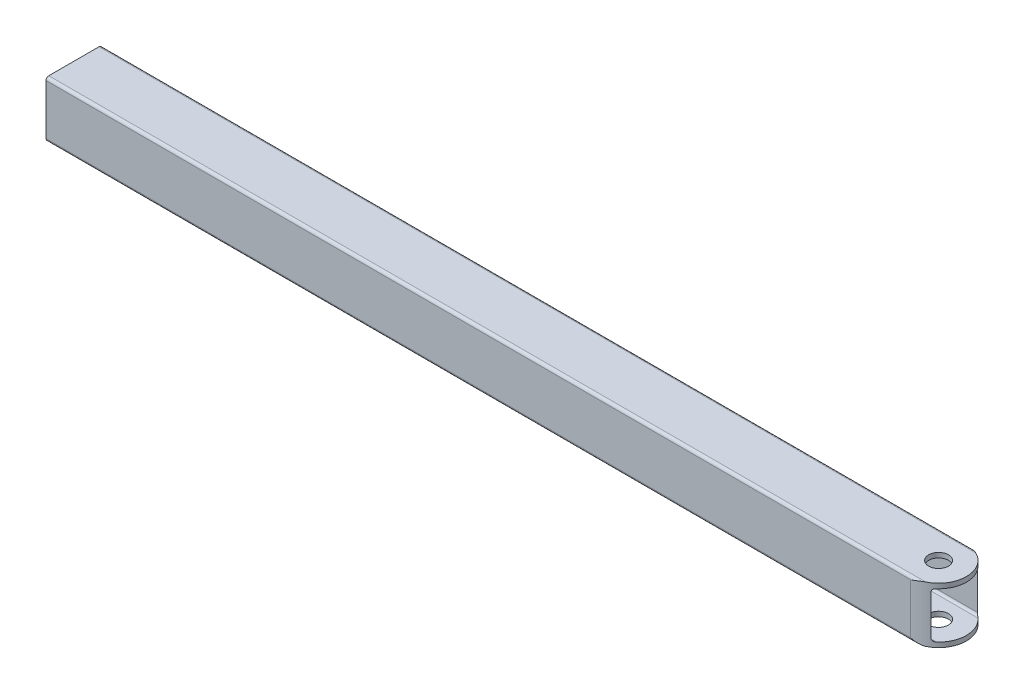
ISO-10303-21;
HEADER;
FILE_DESCRIPTION(('STEP AP214'),'2;1');
FILE_NAME('part.step','',(''),(''),'','','');
FILE_SCHEMA(('AUTOMOTIVE_DESIGN { 1 0 10303 214 1 1 1 1 }'));
ENDSEC;
DATA;
#1=APPLICATION_CONTEXT('core data for automotive mechanical design processes');
#2=APPLICATION_PROTOCOL_DEFINITION('international standard','automotive_design',2000,#1);
#3=PRODUCT_CONTEXT('',#1,'mechanical');
#4=PRODUCT('Part','Part','',(#3));
#5=PRODUCT_RELATED_PRODUCT_CATEGORY('part','',(#4));
#6=PRODUCT_DEFINITION_FORMATION('','',#4);
#7=PRODUCT_DEFINITION_CONTEXT('part definition',#1,'design');
#8=PRODUCT_DEFINITION('design','',#6,#7);
#9=PRODUCT_DEFINITION_SHAPE('','',#8);
#10=(LENGTH_UNIT() NAMED_UNIT(*) SI_UNIT(.MILLI.,.METRE.));
#11=(NAMED_UNIT(*) PLANE_ANGLE_UNIT() SI_UNIT($,.RADIAN.));
#12=(NAMED_UNIT(*) SI_UNIT($,.STERADIAN.) SOLID_ANGLE_UNIT());
#13=UNCERTAINTY_MEASURE_WITH_UNIT(LENGTH_MEASURE(1.E-05),#10,'distance_accuracy_value','');
#14=(GEOMETRIC_REPRESENTATION_CONTEXT(3) GLOBAL_UNCERTAINTY_ASSIGNED_CONTEXT((#13)) GLOBAL_UNIT_ASSIGNED_CONTEXT((#10,
#11,#12)) REPRESENTATION_CONTEXT('',''));
#15=CARTESIAN_POINT('',(0.,0.,0.));
#16=DIRECTION('',(0.,0.,1.));
#17=DIRECTION('',(1.,0.,0.));
#18=AXIS2_PLACEMENT_3D('',#15,#16,#17);
#19=CARTESIAN_POINT('',(152.4,-8.5725,-9.525));
#20=DIRECTION('',(0.,0.,1.));
#21=DIRECTION('',(1.,0.,0.));
#22=AXIS2_PLACEMENT_3D('',#19,#20,#21);
#23=PLANE('',#22);
#24=DIRECTION('',(0.,-1.,0.));
#25=VECTOR('',#24,1.);
#26=CARTESIAN_POINT('',(142.875,9.52500000000001,-9.525));
#27=LINE('',#26,#25);
#28=CARTESIAN_POINT('',(142.875,8.5725,-9.525));
#29=VERTEX_POINT('',#28);
#30=CARTESIAN_POINT('',(142.875,-8.5725,-9.525));
#31=VERTEX_POINT('',#30);
#32=EDGE_CURVE('E200',#29,#31,#27,.T.);
#33=ORIENTED_EDGE('',*,*,#32,.T.);
#34=DIRECTION('',(-1.,0.,0.));
#35=VECTOR('',#34,1.);
#36=CARTESIAN_POINT('',(152.4,-8.5725,-9.525));
#37=LINE('',#36,#35);
#38=CARTESIAN_POINT('',(-152.4,-8.5725,-9.525));
#39=VERTEX_POINT('',#38);
#40=EDGE_CURVE('E53',#31,#39,#37,.T.);
#41=ORIENTED_EDGE('',*,*,#40,.T.);
#42=DIRECTION('',(0.,1.,0.));
#43=VECTOR('',#42,1.);
#44=CARTESIAN_POINT('',(-152.4,-8.5725,-9.525));
#45=LINE('',#44,#43);
#46=CARTESIAN_POINT('',(-152.4,8.5725,-9.525));
#47=VERTEX_POINT('',#46);
#48=EDGE_CURVE('E199',#39,#47,#45,.T.);
#49=ORIENTED_EDGE('',*,*,#48,.T.);
#50=DIRECTION('',(-1.,0.,0.));
#51=VECTOR('',#50,1.);
#52=CARTESIAN_POINT('',(152.4,8.5725,-9.525));
#53=LINE('',#52,#51);
#54=EDGE_CURVE('E193',#29,#47,#53,.T.);
#55=ORIENTED_EDGE('',*,*,#54,.F.);
#56=EDGE_LOOP('',(#33,#41,#49,#55));
#57=FACE_BOUND('',#56,.T.);
#58=ADVANCED_FACE('F43',(#57),#23,.F.);
#59=CARTESIAN_POINT('',(152.4,9.525,-8.5725));
#60=DIRECTION('',(0.,-1.,0.));
#61=DIRECTION('',(0.,0.,-1.));
#62=AXIS2_PLACEMENT_3D('',#59,#60,#61);
#63=PLANE('',#62);
#64=CARTESIAN_POINT('',(142.875,9.525,0.));
#65=DIRECTION('',(0.,1.,0.));
#66=DIRECTION('',(0.,0.,1.));
#67=AXIS2_PLACEMENT_3D('',#64,#65,#66);
#68=CIRCLE('',#67,3.37819999999999);
#69=CARTESIAN_POINT('',(142.875,9.525,3.3782));
#70=VERTEX_POINT('',#69);
#71=EDGE_CURVE('E381',#70,#70,#68,.T.);
#72=ORIENTED_EDGE('',*,*,#71,.F.);
#73=EDGE_LOOP('',(#72));
#74=FACE_BOUND('',#73,.T.);
#75=DIRECTION('',(-1.,0.,0.));
#76=VECTOR('',#75,1.);
#77=CARTESIAN_POINT('',(152.4,9.525,8.5725));
#78=LINE('',#77,#76);
#79=CARTESIAN_POINT('',(147.026851243722,9.525,8.5725));
#80=VERTEX_POINT('',#79);
#81=CARTESIAN_POINT('',(-152.4,9.525,8.5725));
#82=VERTEX_POINT('',#81);
#83=EDGE_CURVE('E189',#80,#82,#78,.T.);
#84=ORIENTED_EDGE('',*,*,#83,.F.);
#85=CARTESIAN_POINT('',(142.875,9.52500000000001,0.));
#86=DIRECTION('',(0.,1.,0.));
#87=DIRECTION('',(0.,0.,1.));
#88=AXIS2_PLACEMENT_3D('',#85,#86,#87);
#89=CIRCLE('',#88,9.525);
#90=CARTESIAN_POINT('',(147.026851243722,9.52500000000001,-8.57249999999999));
#91=VERTEX_POINT('',#90);
#92=EDGE_CURVE('E162',#80,#91,#89,.T.);
#93=ORIENTED_EDGE('',*,*,#92,.T.);
#94=DIRECTION('',(-1.,0.,0.));
#95=VECTOR('',#94,1.);
#96=CARTESIAN_POINT('',(152.4,9.525,-8.5725));
#97=LINE('',#96,#95);
#98=CARTESIAN_POINT('',(-152.4,9.525,-8.5725));
#99=VERTEX_POINT('',#98);
#100=EDGE_CURVE('E191',#91,#99,#97,.T.);
#101=ORIENTED_EDGE('',*,*,#100,.T.);
#102=DIRECTION('',(0.,0.,1.));
#103=VECTOR('',#102,1.);
#104=CARTESIAN_POINT('',(-152.4,9.525,-8.5725));
#105=LINE('',#104,#103);
#106=EDGE_CURVE('E217',#99,#82,#105,.T.);
#107=ORIENTED_EDGE('',*,*,#106,.T.);
#108=EDGE_LOOP('',(#84,#93,#101,#107));
#109=FACE_BOUND('',#108,.T.);
#110=ADVANCED_FACE('F366',(#74,#109),#63,.F.);
#111=CARTESIAN_POINT('',(152.4,-9.525,-8.5725));
#112=DIRECTION('',(0.,1.,0.));
#113=DIRECTION('',(0.,0.,1.));
#114=AXIS2_PLACEMENT_3D('',#111,#112,#113);
#115=PLANE('',#114);
#116=CARTESIAN_POINT('',(142.875,-9.52500000000001,0.));
#117=DIRECTION('',(0.,1.,0.));
#118=DIRECTION('',(0.,0.,1.));
#119=AXIS2_PLACEMENT_3D('',#116,#117,#118);
#120=CIRCLE('',#119,3.37819999999999);
#121=CARTESIAN_POINT('',(142.875,-9.52500000000001,3.3782));
#122=VERTEX_POINT('',#121);
#123=EDGE_CURVE('E402',#122,#122,#120,.T.);
#124=ORIENTED_EDGE('',*,*,#123,.T.);
#125=EDGE_LOOP('',(#124));
#126=FACE_BOUND('',#125,.T.);
#127=DIRECTION('',(-1.,0.,0.));
#128=VECTOR('',#127,1.);
#129=CARTESIAN_POINT('',(152.4,-9.525,-8.5725));
#130=LINE('',#129,#128);
#131=CARTESIAN_POINT('',(147.026851243722,-9.525,-8.5725));
#132=VERTEX_POINT('',#131);
#133=CARTESIAN_POINT('',(-152.4,-9.525,-8.5725));
#134=VERTEX_POINT('',#133);
#135=EDGE_CURVE('E168',#132,#134,#130,.T.);
#136=ORIENTED_EDGE('',*,*,#135,.F.);
#137=CARTESIAN_POINT('',(142.875,-9.525,0.));
#138=DIRECTION('',(0.,1.,0.));
#139=DIRECTION('',(0.,0.,1.));
#140=AXIS2_PLACEMENT_3D('',#137,#138,#139);
#141=CIRCLE('',#140,9.525);
#142=CARTESIAN_POINT('',(147.026851243722,-9.52500000000001,8.5725));
#143=VERTEX_POINT('',#142);
#144=EDGE_CURVE('E60',#143,#132,#141,.T.);
#145=ORIENTED_EDGE('',*,*,#144,.F.);
#146=DIRECTION('',(-1.,0.,0.));
#147=VECTOR('',#146,1.);
#148=CARTESIAN_POINT('',(152.4,-9.525,8.5725));
#149=LINE('',#148,#147);
#150=CARTESIAN_POINT('',(-152.4,-9.525,8.5725));
#151=VERTEX_POINT('',#150);
#152=EDGE_CURVE('E177',#143,#151,#149,.T.);
#153=ORIENTED_EDGE('',*,*,#152,.T.);
#154=DIRECTION('',(0.,0.,-1.));
#155=VECTOR('',#154,1.);
#156=CARTESIAN_POINT('',(-152.4,-9.525,-8.5725));
#157=LINE('',#156,#155);
#158=EDGE_CURVE('E176',#151,#134,#157,.T.);
#159=ORIENTED_EDGE('',*,*,#158,.T.);
#160=EDGE_LOOP('',(#136,#145,#153,#159));
#161=FACE_BOUND('',#160,.T.);
#162=ADVANCED_FACE('F174',(#126,#161),#115,.F.);
#163=CARTESIAN_POINT('',(152.4,7.874,-7.0866));
#164=DIRECTION('',(0.,-1.,0.));
#165=DIRECTION('',(0.,0.,-1.));
#166=AXIS2_PLACEMENT_3D('',#163,#164,#165);
#167=PLANE('',#166);
#168=CARTESIAN_POINT('',(142.875,7.874,0.));
#169=DIRECTION('',(0.,-1.,0.));
#170=DIRECTION('',(0.,0.,-1.));
#171=AXIS2_PLACEMENT_3D('',#168,#169,#170);
#172=CIRCLE('',#171,3.37819999999999);
#173=CARTESIAN_POINT('',(142.875,7.874,-3.37819999999999));
#174=VERTEX_POINT('',#173);
#175=EDGE_CURVE('E163',#174,#174,#172,.T.);
#176=ORIENTED_EDGE('',*,*,#175,.F.);
#177=EDGE_LOOP('',(#176));
#178=FACE_BOUND('',#177,.T.);
#179=CARTESIAN_POINT('',(142.875,7.874,0.));
#180=DIRECTION('',(0.,-1.,0.));
#181=DIRECTION('',(0.,0.,-1.));
#182=AXIS2_PLACEMENT_3D('',#179,#180,#181);
#183=CIRCLE('',#182,9.525);
#184=CARTESIAN_POINT('',(149.239410847832,7.874,7.0866));
#185=VERTEX_POINT('',#184);
#186=CARTESIAN_POINT('',(149.239410847832,7.874,-7.0866));
#187=VERTEX_POINT('',#186);
#188=EDGE_CURVE('E251',#185,#187,#183,.F.);
#189=ORIENTED_EDGE('',*,*,#188,.F.);
#190=DIRECTION('',(-1.,0.,0.));
#191=VECTOR('',#190,1.);
#192=CARTESIAN_POINT('',(152.4,7.874,7.0866));
#193=LINE('',#192,#191);
#194=CARTESIAN_POINT('',(-152.4,7.874,7.0866));
#195=VERTEX_POINT('',#194);
#196=EDGE_CURVE('E182',#185,#195,#193,.T.);
#197=ORIENTED_EDGE('',*,*,#196,.T.);
#198=DIRECTION('',(0.,0.,1.));
#199=VECTOR('',#198,1.);
#200=CARTESIAN_POINT('',(-152.4,7.874,-7.0866));
#201=LINE('',#200,#199);
#202=CARTESIAN_POINT('',(-152.4,7.874,-7.0866));
#203=VERTEX_POINT('',#202);
#204=EDGE_CURVE('E249',#203,#195,#201,.T.);
#205=ORIENTED_EDGE('',*,*,#204,.F.);
#206=DIRECTION('',(-1.,0.,0.));
#207=VECTOR('',#206,1.);
#208=CARTESIAN_POINT('',(152.4,7.874,-7.0866));
#209=LINE('',#208,#207);
#210=EDGE_CURVE('E178',#187,#203,#209,.T.);
#211=ORIENTED_EDGE('',*,*,#210,.F.);
#212=EDGE_LOOP('',(#189,#197,#205,#211));
#213=FACE_BOUND('',#212,.T.);
#214=ADVANCED_FACE('F246',(#178,#213),#167,.T.);
#215=CARTESIAN_POINT('',(152.4,-7.874,-7.0866));
#216=DIRECTION('',(0.,1.,0.));
#217=DIRECTION('',(0.,0.,1.));
#218=AXIS2_PLACEMENT_3D('',#215,#216,#217);
#219=PLANE('',#218);
#220=CARTESIAN_POINT('',(142.875,-7.874,0.));
#221=DIRECTION('',(0.,1.,0.));
#222=DIRECTION('',(0.,0.,1.));
#223=AXIS2_PLACEMENT_3D('',#220,#221,#222);
#224=CIRCLE('',#223,3.37819999999999);
#225=CARTESIAN_POINT('',(142.875,-7.874,3.3782));
#226=VERTEX_POINT('',#225);
#227=EDGE_CURVE('E48',#226,#226,#224,.T.);
#228=ORIENTED_EDGE('',*,*,#227,.F.);
#229=EDGE_LOOP('',(#228));
#230=FACE_BOUND('',#229,.T.);
#231=CARTESIAN_POINT('',(142.875,-7.874,0.));
#232=DIRECTION('',(0.,1.,0.));
#233=DIRECTION('',(0.,0.,1.));
#234=AXIS2_PLACEMENT_3D('',#231,#232,#233);
#235=CIRCLE('',#234,9.525);
#236=CARTESIAN_POINT('',(149.239410847832,-7.874,-7.0866));
#237=VERTEX_POINT('',#236);
#238=CARTESIAN_POINT('',(149.239410847832,-7.874,7.0866));
#239=VERTEX_POINT('',#238);
#240=EDGE_CURVE('E288',#237,#239,#235,.F.);
#241=ORIENTED_EDGE('',*,*,#240,.F.);
#242=DIRECTION('',(-1.,0.,0.));
#243=VECTOR('',#242,1.);
#244=CARTESIAN_POINT('',(152.4,-7.874,-7.0866));
#245=LINE('',#244,#243);
#246=CARTESIAN_POINT('',(-152.4,-7.874,-7.0866));
#247=VERTEX_POINT('',#246);
#248=EDGE_CURVE('E234',#237,#247,#245,.T.);
#249=ORIENTED_EDGE('',*,*,#248,.T.);
#250=DIRECTION('',(0.,0.,-1.));
#251=VECTOR('',#250,1.);
#252=CARTESIAN_POINT('',(-152.4,-7.874,-7.0866));
#253=LINE('',#252,#251);
#254=CARTESIAN_POINT('',(-152.4,-7.874,7.0866));
#255=VERTEX_POINT('',#254);
#256=EDGE_CURVE('E271',#255,#247,#253,.T.);
#257=ORIENTED_EDGE('',*,*,#256,.F.);
#258=DIRECTION('',(-1.,0.,0.));
#259=VECTOR('',#258,1.);
#260=CARTESIAN_POINT('',(152.4,-7.874,7.0866));
#261=LINE('',#260,#259);
#262=EDGE_CURVE('E236',#239,#255,#261,.T.);
#263=ORIENTED_EDGE('',*,*,#262,.F.);
#264=EDGE_LOOP('',(#241,#249,#257,#263));
#265=FACE_BOUND('',#264,.T.);
#266=ADVANCED_FACE('F410',(#230,#265),#219,.T.);
#267=CARTESIAN_POINT('',(152.4,-8.5725,-8.57250000000001));
#268=DIRECTION('',(-1.,0.,0.));
#269=DIRECTION('',(0.,0.,1.));
#270=AXIS2_PLACEMENT_3D('',#267,#268,#269);
#271=CYLINDRICAL_SURFACE('',#270,0.952499999999997);
#272=ORIENTED_EDGE('',*,*,#40,.F.);
#273=CARTESIAN_POINT('',(147.026851243722,-9.525,-8.5725));
#274=CARTESIAN_POINT('',(146.957964048173,-9.52498554189875,-8.60586552795667));
#275=CARTESIAN_POINT('',(146.888690489495,-9.52324763645544,-8.63838924502475));
#276=CARTESIAN_POINT('',(146.749526256003,-9.51673705058331,-8.70169543137904));
#277=CARTESIAN_POINT('',(146.679635857857,-9.51196566869114,-8.73247863958599));
#278=CARTESIAN_POINT('',(146.539471236643,-9.49981139954743,-8.79221648535186));
#279=CARTESIAN_POINT('',(146.469198028165,-9.49243362436644,-8.82117457253954));
#280=CARTESIAN_POINT('',(146.328216150287,-9.47538748245734,-8.87731274693715));
#281=CARTESIAN_POINT('',(146.257507428818,-9.46571883644631,-8.90449261684644));
#282=CARTESIAN_POINT('',(146.045436409541,-9.43379882390901,-8.98312990539054));
#283=CARTESIAN_POINT('',(145.903527469787,-9.40857615573225,-9.03194103835549));
#284=CARTESIAN_POINT('',(145.618641226107,-9.35197549229294,-9.12252311165041));
#285=CARTESIAN_POINT('',(145.475663295356,-9.32059355966789,-9.16428951665411));
#286=CARTESIAN_POINT('',(145.130800697768,-9.2393751543217,-9.25637473285302));
#287=CARTESIAN_POINT('',(144.928544961312,-9.18721620562017,-9.3032913480507));
#288=CARTESIAN_POINT('',(144.523170870755,-9.07653533517809,-9.38359710108552));
#289=CARTESIAN_POINT('',(144.320052392097,-9.01801246240408,-9.41698421352199));
#290=CARTESIAN_POINT('',(143.709706879091,-8.83643126141263,-9.49722291968856));
#291=CARTESIAN_POINT('',(143.301362722,-8.70732734800355,-9.52418539754674));
#292=CARTESIAN_POINT('',(142.887407096813,-8.57642344867504,-9.52499393532463));
#293=CARTESIAN_POINT('',(142.881203476188,-8.57446169112702,-9.52499999552055));
#294=CARTESIAN_POINT('',(142.875,-8.5725,-9.525));
#295=B_SPLINE_CURVE_WITH_KNOTS('',3,(#273,#274,#275,#276,#277,#278,#279,#280,#281,#282,#283,
#284,#285,#286,#287,#288,#289,#290,#291,#292,#293,#294),.UNSPECIFIED.,.F.,.F.,(4,2,2,2,2,2,2,2,
2,2,4),(0.,0.229573949060686,0.45904969078246,0.688077824637956,0.917133893976532,
1.37328126370581,1.82972118491536,2.47129320771587,3.11296124001593,4.39589373575992,
4.4154129655239),.UNSPECIFIED.);
#296=EDGE_CURVE('E157',#31,#132,#295,.F.);
#297=ORIENTED_EDGE('',*,*,#296,.T.);
#298=ORIENTED_EDGE('',*,*,#135,.T.);
#299=CARTESIAN_POINT('',(-152.4,-8.5725,-8.57250000000001));
#300=DIRECTION('',(1.,0.,0.));
#301=DIRECTION('',(0.,0.,-1.));
#302=AXIS2_PLACEMENT_3D('',#299,#300,#301);
#303=CIRCLE('',#302,0.952499999999997);
#304=EDGE_CURVE('E204',#134,#39,#303,.T.);
#305=ORIENTED_EDGE('',*,*,#304,.T.);
#306=EDGE_LOOP('',(#272,#297,#298,#305));
#307=FACE_BOUND('',#306,.T.);
#308=ADVANCED_FACE('F45',(#307),#271,.T.);
#309=CARTESIAN_POINT('',(152.4,8.5725,-8.5725));
#310=DIRECTION('',(-1.,0.,0.));
#311=DIRECTION('',(0.,0.,1.));
#312=AXIS2_PLACEMENT_3D('',#309,#310,#311);
#313=CYLINDRICAL_SURFACE('',#312,0.9525);
#314=ORIENTED_EDGE('',*,*,#100,.F.);
#315=CARTESIAN_POINT('',(147.026851243722,9.525,-8.5725));
#316=CARTESIAN_POINT('',(146.957964048173,9.52498554189875,-8.6058655279566));
#317=CARTESIAN_POINT('',(146.888690489495,9.52324763645545,-8.63838924502461));
#318=CARTESIAN_POINT('',(146.749526256004,9.51673705058334,-8.70169543137878));
#319=CARTESIAN_POINT('',(146.679635857858,9.51196566869119,-8.73247863958567));
#320=CARTESIAN_POINT('',(146.539471236644,9.49981139954752,-8.79221648535145));
#321=CARTESIAN_POINT('',(146.469198028166,9.49243362436656,-8.8211745725391));
#322=CARTESIAN_POINT('',(146.328216150288,9.47538748245751,-8.87731274693665));
#323=CARTESIAN_POINT('',(146.257507428819,9.46571883644651,-8.90449261684591));
#324=CARTESIAN_POINT('',(146.045436409543,9.43379882390923,-8.98312990539009));
#325=CARTESIAN_POINT('',(145.903527469788,9.40857615573246,-9.03194103835515));
#326=CARTESIAN_POINT('',(145.618641226108,9.35197549229303,-9.12252311165026));
#327=CARTESIAN_POINT('',(145.475663295356,9.32059355966787,-9.16428951665404));
#328=CARTESIAN_POINT('',(145.130800697768,9.23937515432179,-9.25637473285303));
#329=CARTESIAN_POINT('',(144.928544961311,9.18721620562059,-9.30329134805072));
#330=CARTESIAN_POINT('',(144.523170870755,9.07653533517759,-9.38359710108556));
#331=CARTESIAN_POINT('',(144.320052392097,9.01801246240232,-9.41698421352203));
#332=CARTESIAN_POINT('',(143.709706879089,8.83643126141593,-9.49722291968856));
#333=CARTESIAN_POINT('',(143.301362721994,8.70732734802196,-9.5241853975467));
#334=CARTESIAN_POINT('',(142.887407096813,8.57642344867561,-9.52499393532463));
#335=CARTESIAN_POINT('',(142.881203476188,8.57446169112731,-9.52499999552054));
#336=CARTESIAN_POINT('',(142.875,8.5725,-9.525));
#337=B_SPLINE_CURVE_WITH_KNOTS('',3,(#315,#316,#317,#318,#319,#320,#321,#322,#323,#324,#325,
#326,#327,#328,#329,#330,#331,#332,#333,#334,#335,#336),.UNSPECIFIED.,.F.,.F.,(4,2,2,2,2,2,2,2,
2,2,4),(0.,0.229573949060225,0.459049690781491,0.68807782463672,0.917133893974885,
1.37328126370503,1.82972118491539,2.47129320771601,3.11296124001633,4.39589373575986,
4.4154129655239),.UNSPECIFIED.);
#338=EDGE_CURVE('E171',#91,#29,#337,.T.);
#339=ORIENTED_EDGE('',*,*,#338,.T.);
#340=ORIENTED_EDGE('',*,*,#54,.T.);
#341=CARTESIAN_POINT('',(-152.4,8.5725,-8.5725));
#342=DIRECTION('',(1.,0.,0.));
#343=DIRECTION('',(0.,0.,-1.));
#344=AXIS2_PLACEMENT_3D('',#341,#342,#343);
#345=CIRCLE('',#344,0.9525);
#346=EDGE_CURVE('E207',#47,#99,#345,.T.);
#347=ORIENTED_EDGE('',*,*,#346,.T.);
#348=EDGE_LOOP('',(#314,#339,#340,#347));
#349=FACE_BOUND('',#348,.T.);
#350=ADVANCED_FACE('F360',(#349),#313,.T.);
#351=CARTESIAN_POINT('',(152.4,8.5725,8.5725));
#352=DIRECTION('',(-1.,0.,0.));
#353=DIRECTION('',(0.,0.,1.));
#354=AXIS2_PLACEMENT_3D('',#351,#352,#353);
#355=CYLINDRICAL_SURFACE('',#354,0.952500000000002);
#356=DIRECTION('',(-1.,0.,0.));
#357=VECTOR('',#356,1.);
#358=CARTESIAN_POINT('',(152.4,8.5725,9.525));
#359=LINE('',#358,#357);
#360=CARTESIAN_POINT('',(142.875,8.5725,9.52500000000001));
#361=VERTEX_POINT('',#360);
#362=CARTESIAN_POINT('',(-152.4,8.5725,9.525));
#363=VERTEX_POINT('',#362);
#364=EDGE_CURVE('E187',#361,#363,#359,.T.);
#365=ORIENTED_EDGE('',*,*,#364,.F.);
#366=CARTESIAN_POINT('',(147.026851243722,9.525,8.5725));
#367=CARTESIAN_POINT('',(146.957964048173,9.52498554189875,8.60586552795672));
#368=CARTESIAN_POINT('',(146.888690489495,9.52324763645544,8.63838924502484));
#369=CARTESIAN_POINT('',(146.749526256003,9.51673705058329,8.70169543137922));
#370=CARTESIAN_POINT('',(146.679635857856,9.51196566869111,8.73247863958621));
#371=CARTESIAN_POINT('',(146.539471236642,9.49981139954736,8.79221648535215));
#372=CARTESIAN_POINT('',(146.469198028164,9.49243362436636,8.82117457253986));
#373=CARTESIAN_POINT('',(146.328216150286,9.47538748245722,8.87731274693752));
#374=CARTESIAN_POINT('',(146.257507428817,9.46571883644618,8.90449261684683));
#375=CARTESIAN_POINT('',(146.04543640954,9.43379882390886,8.98312990539084));
#376=CARTESIAN_POINT('',(145.903527469786,9.40857615573212,9.03194103835571));
#377=CARTESIAN_POINT('',(145.618641226107,9.35197549229289,9.1225231116505));
#378=CARTESIAN_POINT('',(145.475663295356,9.3205935596679,9.16428951665415));
#379=CARTESIAN_POINT('',(145.130800697769,9.23937515432164,9.25637473285301));
#380=CARTESIAN_POINT('',(144.928544961312,9.18721620561988,9.30329134805069));
#381=CARTESIAN_POINT('',(144.523170870756,9.07653533517844,9.3835971010855));
#382=CARTESIAN_POINT('',(144.320052392097,9.01801246240531,9.41698421352196));
#383=CARTESIAN_POINT('',(143.709706879092,8.83643126141035,9.49722291968854));
#384=CARTESIAN_POINT('',(143.301362722004,8.7073273479908,9.52418539754675));
#385=CARTESIAN_POINT('',(142.887407096814,8.57642344867466,9.52499393532464));
#386=CARTESIAN_POINT('',(142.881203476188,8.57446169112683,9.52499999552055));
#387=CARTESIAN_POINT('',(142.875,8.5725,9.52500000000001));
#388=B_SPLINE_CURVE_WITH_KNOTS('',3,(#366,#367,#368,#369,#370,#371,#372,#373,#374,#375,#376,
#377,#378,#379,#380,#381,#382,#383,#384,#385,#386,#387),.UNSPECIFIED.,.F.,.F.,(4,2,2,2,2,2,2,2,
2,2,4),(0.,0.229573949061022,0.459049690783098,0.68807782463889,0.91713389397767,
1.37328126370631,1.82972118491533,2.47129320771576,3.11296124001564,4.39589373575988,
4.4154129655239),.UNSPECIFIED.);
#389=EDGE_CURVE('E343',#361,#80,#388,.F.);
#390=ORIENTED_EDGE('',*,*,#389,.T.);
#391=ORIENTED_EDGE('',*,*,#83,.T.);
#392=CARTESIAN_POINT('',(-152.4,8.5725,8.5725));
#393=DIRECTION('',(1.,0.,0.));
#394=DIRECTION('',(0.,0.,-1.));
#395=AXIS2_PLACEMENT_3D('',#392,#393,#394);
#396=CIRCLE('',#395,0.952500000000002);
#397=EDGE_CURVE('E220',#82,#363,#396,.T.);
#398=ORIENTED_EDGE('',*,*,#397,.T.);
#399=EDGE_LOOP('',(#365,#390,#391,#398));
#400=FACE_BOUND('',#399,.T.);
#401=ADVANCED_FACE('F364',(#400),#355,.T.);
#402=CARTESIAN_POINT('',(152.4,-8.5725,9.525));
#403=DIRECTION('',(0.,0.,-1.));
#404=DIRECTION('',(-1.,0.,0.));
#405=AXIS2_PLACEMENT_3D('',#402,#403,#404);
#406=PLANE('',#405);
#407=DIRECTION('',(-1.,0.,0.));
#408=VECTOR('',#407,1.);
#409=CARTESIAN_POINT('',(152.4,-8.5725,9.525));
#410=LINE('',#409,#408);
#411=CARTESIAN_POINT('',(142.875,-8.5725,9.525));
#412=VERTEX_POINT('',#411);
#413=CARTESIAN_POINT('',(-152.4,-8.5725,9.525));
#414=VERTEX_POINT('',#413);
#415=EDGE_CURVE('E180',#412,#414,#410,.T.);
#416=ORIENTED_EDGE('',*,*,#415,.F.);
#417=DIRECTION('',(0.,-1.,0.));
#418=VECTOR('',#417,1.);
#419=CARTESIAN_POINT('',(142.875,9.525,9.52500000000001));
#420=LINE('',#419,#418);
#421=EDGE_CURVE('E395',#361,#412,#420,.T.);
#422=ORIENTED_EDGE('',*,*,#421,.F.);
#423=ORIENTED_EDGE('',*,*,#364,.T.);
#424=DIRECTION('',(0.,-1.,0.));
#425=VECTOR('',#424,1.);
#426=CARTESIAN_POINT('',(-152.4,-8.5725,9.525));
#427=LINE('',#426,#425);
#428=EDGE_CURVE('E223',#363,#414,#427,.T.);
#429=ORIENTED_EDGE('',*,*,#428,.T.);
#430=EDGE_LOOP('',(#416,#422,#423,#429));
#431=FACE_BOUND('',#430,.T.);
#432=ADVANCED_FACE('F393',(#431),#406,.F.);
#433=CARTESIAN_POINT('',(152.4,-8.5725,8.5725));
#434=DIRECTION('',(-1.,0.,0.));
#435=DIRECTION('',(0.,0.,1.));
#436=AXIS2_PLACEMENT_3D('',#433,#434,#435);
#437=CYLINDRICAL_SURFACE('',#436,0.952499999999998);
#438=ORIENTED_EDGE('',*,*,#152,.F.);
#439=CARTESIAN_POINT('',(147.026851243722,-9.525,8.5725));
#440=CARTESIAN_POINT('',(146.957964048173,-9.52498554189875,8.60586552795667));
#441=CARTESIAN_POINT('',(146.888690489495,-9.52324763645545,8.63838924502475));
#442=CARTESIAN_POINT('',(146.749526256003,-9.51673705058332,8.70169543137904));
#443=CARTESIAN_POINT('',(146.679635857857,-9.51196566869114,8.73247863958599));
#444=CARTESIAN_POINT('',(146.539471236643,-9.49981139954743,8.79221648535186));
#445=CARTESIAN_POINT('',(146.469198028165,-9.49243362436645,8.82117457253954));
#446=CARTESIAN_POINT('',(146.328216150287,-9.47538748245735,8.87731274693715));
#447=CARTESIAN_POINT('',(146.257507428818,-9.46571883644632,8.90449261684644));
#448=CARTESIAN_POINT('',(146.045436409541,-9.43379882390902,8.98312990539054));
#449=CARTESIAN_POINT('',(145.903527469787,-9.40857615573226,9.03194103835549));
#450=CARTESIAN_POINT('',(145.618641226107,-9.35197549229295,9.12252311165041));
#451=CARTESIAN_POINT('',(145.475663295356,-9.32059355966789,9.16428951665411));
#452=CARTESIAN_POINT('',(145.130800697768,-9.23937515432171,9.25637473285302));
#453=CARTESIAN_POINT('',(144.928544961312,-9.18721620562017,9.3032913480507));
#454=CARTESIAN_POINT('',(144.523170870755,-9.07653533517809,9.38359710108552));
#455=CARTESIAN_POINT('',(144.320052392097,-9.01801246240409,9.41698421352199));
#456=CARTESIAN_POINT('',(143.709706879091,-8.83643126141263,9.49722291968856));
#457=CARTESIAN_POINT('',(143.301362722,-8.70732734800355,9.52418539754674));
#458=CARTESIAN_POINT('',(142.887407096813,-8.57642344867504,9.52499393532463));
#459=CARTESIAN_POINT('',(142.881203476188,-8.57446169112702,9.52499999552055));
#460=CARTESIAN_POINT('',(142.875,-8.5725,9.525));
#461=B_SPLINE_CURVE_WITH_KNOTS('',3,(#439,#440,#441,#442,#443,#444,#445,#446,#447,#448,#449,
#450,#451,#452,#453,#454,#455,#456,#457,#458,#459,#460),.UNSPECIFIED.,.F.,.F.,(4,2,2,2,2,2,2,2,
2,2,4),(0.,0.229573949060686,0.45904969078246,0.688077824637956,0.917133893976532,
1.37328126370581,1.82972118491536,2.47129320771587,3.11296124001593,4.39589373575992,
4.4154129655239),.UNSPECIFIED.);
#462=EDGE_CURVE('E160',#143,#412,#461,.T.);
#463=ORIENTED_EDGE('',*,*,#462,.T.);
#464=ORIENTED_EDGE('',*,*,#415,.T.);
#465=CARTESIAN_POINT('',(-152.4,-8.5725,8.5725));
#466=DIRECTION('',(1.,0.,0.));
#467=DIRECTION('',(0.,0.,-1.));
#468=AXIS2_PLACEMENT_3D('',#465,#466,#467);
#469=CIRCLE('',#468,0.952499999999998);
#470=EDGE_CURVE('E226',#414,#151,#469,.T.);
#471=ORIENTED_EDGE('',*,*,#470,.T.);
#472=EDGE_LOOP('',(#438,#463,#464,#471));
#473=FACE_BOUND('',#472,.T.);
#474=ADVANCED_FACE('F514',(#473),#437,.T.);
#475=CARTESIAN_POINT('',(152.4,7.0866,-7.0866));
#476=DIRECTION('',(-1.,0.,0.));
#477=DIRECTION('',(0.,0.,1.));
#478=AXIS2_PLACEMENT_3D('',#475,#476,#477);
#479=CYLINDRICAL_SURFACE('',#478,0.787399999999998);
#480=CARTESIAN_POINT('',(149.239410847832,7.874,-7.0866));
#481=CARTESIAN_POINT('',(149.201934460014,7.87398357066911,-7.12026213212581));
#482=CARTESIAN_POINT('',(149.164194173684,7.87184134289685,-7.15361442386383));
#483=CARTESIAN_POINT('',(149.088428619272,7.86341571502308,-7.21951756860481));
#484=CARTESIAN_POINT('',(149.050403170733,7.85712942672233,-7.25206784621961));
#485=CARTESIAN_POINT('',(148.973966838353,7.84043990644751,-7.3164715877842));
#486=CARTESIAN_POINT('',(148.9355560685,7.82999444320449,-7.34831425147891));
#487=CARTESIAN_POINT('',(148.859076303683,7.80497974791537,-7.4107280961885));
#488=CARTESIAN_POINT('',(148.821007166958,7.79041231645278,-7.44129982570764));
#489=CARTESIAN_POINT('',(148.73121936188,7.75068239288444,-7.51230436965415));
#490=CARTESIAN_POINT('',(148.679808023038,7.72359722089956,-7.55207249170567));
#491=CARTESIAN_POINT('',(148.579862162306,7.6605976045481,-7.62784820782067));
#492=CARTESIAN_POINT('',(148.531317860384,7.62471562008913,-7.66386894886882));
#493=CARTESIAN_POINT('',(148.457619060937,7.55870332653478,-7.71758980327453));
#494=CARTESIAN_POINT('',(148.430754534933,7.53183100580679,-7.73693700975238));
#495=CARTESIAN_POINT('',(148.380060538691,7.47377180767744,-7.77308781067051));
#496=CARTESIAN_POINT('',(148.356228755105,7.4425882571893,-7.78989334574116));
#497=CARTESIAN_POINT('',(148.318715345237,7.3841291982214,-7.81613555176024));
#498=CARTESIAN_POINT('',(148.303994720153,7.35788262838994,-7.82635872521813));
#499=CARTESIAN_POINT('',(148.278121761627,7.30294806719061,-7.84424281202358));
#500=CARTESIAN_POINT('',(148.266955691379,7.27427003057895,-7.85191359458473));
#501=CARTESIAN_POINT('',(148.250571480536,7.21941585767978,-7.86313839559197));
#502=CARTESIAN_POINT('',(148.244703659934,7.19353082537206,-7.86714343600911));
#503=CARTESIAN_POINT('',(148.236689574656,7.14066491553116,-7.87260557526378));
#504=CARTESIAN_POINT('',(148.234582387169,7.11367547900438,-7.87403592144693));
#505=CARTESIAN_POINT('',(148.234640752886,7.0866,-7.874));
#506=B_SPLINE_CURVE_WITH_KNOTS('',3,(#480,#481,#482,#483,#484,#485,#486,#487,#488,#489,#490,
#491,#492,#493,#494,#495,#496,#497,#498,#499,#500,#501,#502,#503,#504,#505),.UNSPECIFIED.,.F.,
.F.,(4,2,2,2,2,2,2,2,2,2,2,2,4),(0.,0.151062827702844,0.302231049973471,0.454975023805234,
0.607652377807957,0.818316823528686,1.02821532614404,1.15584415990343,1.28337504844651,
1.37840918445569,1.47307146633958,1.55321170403661,1.63417994405896),.UNSPECIFIED.);
#507=CARTESIAN_POINT('',(148.234640752886,7.0866,-7.874));
#508=VERTEX_POINT('',#507);
#509=EDGE_CURVE('E67',#187,#508,#506,.T.);
#510=ORIENTED_EDGE('',*,*,#509,.F.);
#511=ORIENTED_EDGE('',*,*,#210,.T.);
#512=CARTESIAN_POINT('',(-152.4,7.0866,-7.0866));
#513=DIRECTION('',(1.,0.,0.));
#514=DIRECTION('',(0.,0.,-1.));
#515=AXIS2_PLACEMENT_3D('',#512,#513,#514);
#516=CIRCLE('',#515,0.787399999999998);
#517=CARTESIAN_POINT('',(-152.4,7.0866,-7.874));
#518=VERTEX_POINT('',#517);
#519=EDGE_CURVE('E170',#518,#203,#516,.T.);
#520=ORIENTED_EDGE('',*,*,#519,.F.);
#521=DIRECTION('',(-1.,0.,0.));
#522=VECTOR('',#521,1.);
#523=CARTESIAN_POINT('',(152.4,7.0866,-7.874));
#524=LINE('',#523,#522);
#525=EDGE_CURVE('E230',#508,#518,#524,.T.);
#526=ORIENTED_EDGE('',*,*,#525,.F.);
#527=EDGE_LOOP('',(#510,#511,#520,#526));
#528=FACE_BOUND('',#527,.T.);
#529=ADVANCED_FACE('F287',(#528),#479,.F.);
#530=CARTESIAN_POINT('',(152.4,7.0866,7.0866));
#531=DIRECTION('',(-1.,0.,0.));
#532=DIRECTION('',(0.,0.,1.));
#533=AXIS2_PLACEMENT_3D('',#530,#531,#532);
#534=CYLINDRICAL_SURFACE('',#533,0.787400000000002);
#535=CARTESIAN_POINT('',(148.234640752886,7.0866,7.874));
#536=CARTESIAN_POINT('',(148.234585488222,7.11330409248263,7.87403397048003));
#537=CARTESIAN_POINT('',(148.236633931884,7.13992601934636,7.87264342578787));
#538=CARTESIAN_POINT('',(148.244433188188,7.19209131468425,7.86732792637751));
#539=CARTESIAN_POINT('',(148.250145686807,7.21764296265001,7.86342919780379));
#540=CARTESIAN_POINT('',(148.266489091531,7.27310830265641,7.85223422878381));
#541=CARTESIAN_POINT('',(148.277955003601,7.30265403728817,7.84435862660273));
#542=CARTESIAN_POINT('',(148.304634295042,7.35917917519492,7.82591607129036));
#543=CARTESIAN_POINT('',(148.31986360255,7.38614697682102,7.81533767225239));
#544=CARTESIAN_POINT('',(148.361439487308,7.45033185911153,7.78623949625457));
#545=CARTESIAN_POINT('',(148.389510908226,7.48582541402781,7.76641063359664));
#546=CARTESIAN_POINT('',(148.449409019954,7.55119236472142,7.72353303609426));
#547=CARTESIAN_POINT('',(148.48124332729,7.58105403267456,7.70047775263524));
#548=CARTESIAN_POINT('',(148.568007462331,7.65309341141937,7.63673419042551));
#549=CARTESIAN_POINT('',(148.624864131669,7.6911955449729,7.59407991709529));
#550=CARTESIAN_POINT('',(148.741446487229,7.75631544967552,7.50439112485985));
#551=CARTESIAN_POINT('',(148.801179007449,7.78330519843756,7.45734589482625));
#552=CARTESIAN_POINT('',(148.892920850658,7.81652543300406,7.38321766734847));
#553=CARTESIAN_POINT('',(148.924569643686,7.82651822459641,7.35731140104554));
#554=CARTESIAN_POINT('',(148.987982727718,7.84369560418733,7.30470823516994));
#555=CARTESIAN_POINT('',(149.019747024182,7.85088005760127,7.27801129777171));
#556=CARTESIAN_POINT('',(149.082963738777,7.86237562331751,7.22416222700121));
#557=CARTESIAN_POINT('',(149.114416622062,7.86670921968335,7.19701543009768));
#558=CARTESIAN_POINT('',(149.177110202882,7.87251748512753,7.14218276568323));
#559=CARTESIAN_POINT('',(149.208350917698,7.87399238989352,7.11449694280297));
#560=CARTESIAN_POINT('',(149.239410847832,7.874,7.0866));
#561=B_SPLINE_CURVE_WITH_KNOTS('',3,(#535,#536,#537,#538,#539,#540,#541,#542,#543,#544,#545,
#546,#547,#548,#549,#550,#551,#552,#553,#554,#555,#556,#557,#558,#559,#560),.UNSPECIFIED.,.F.,
.F.,(4,2,2,2,2,2,2,2,2,2,2,2,4),(0.,0.0798646718060583,0.158907541476034,0.256337402154358,
0.354186906333688,0.501576569424477,0.649269846938018,0.889908201063806,1.13114971638563,
1.2573716967692,1.38359972537646,1.50881989102868,1.63402973234066),.UNSPECIFIED.);
#562=CARTESIAN_POINT('',(148.234640752886,7.0866,7.874));
#563=VERTEX_POINT('',#562);
#564=EDGE_CURVE('E290',#563,#185,#561,.T.);
#565=ORIENTED_EDGE('',*,*,#564,.F.);
#566=DIRECTION('',(-1.,0.,0.));
#567=VECTOR('',#566,1.);
#568=CARTESIAN_POINT('',(152.4,7.0866,7.874));
#569=LINE('',#568,#567);
#570=CARTESIAN_POINT('',(-152.4,7.0866,7.874));
#571=VERTEX_POINT('',#570);
#572=EDGE_CURVE('E240',#563,#571,#569,.T.);
#573=ORIENTED_EDGE('',*,*,#572,.T.);
#574=CARTESIAN_POINT('',(-152.4,7.0866,7.0866));
#575=DIRECTION('',(1.,0.,0.));
#576=DIRECTION('',(0.,0.,-1.));
#577=AXIS2_PLACEMENT_3D('',#574,#575,#576);
#578=CIRCLE('',#577,0.787400000000002);
#579=EDGE_CURVE('E255',#195,#571,#578,.T.);
#580=ORIENTED_EDGE('',*,*,#579,.F.);
#581=ORIENTED_EDGE('',*,*,#196,.F.);
#582=EDGE_LOOP('',(#565,#573,#580,#581));
#583=FACE_BOUND('',#582,.T.);
#584=ADVANCED_FACE('F256',(#583),#534,.F.);
#585=CARTESIAN_POINT('',(152.4,7.0866,7.874));
#586=DIRECTION('',(0.,0.,-1.));
#587=DIRECTION('',(0.,1.,0.));
#588=AXIS2_PLACEMENT_3D('',#585,#586,#587);
#589=PLANE('',#588);
#590=DIRECTION('',(0.,-1.,0.));
#591=VECTOR('',#590,1.);
#592=CARTESIAN_POINT('',(148.234640752886,9.525,7.874));
#593=LINE('',#592,#591);
#594=CARTESIAN_POINT('',(148.234640752886,-7.0866,7.874));
#595=VERTEX_POINT('',#594);
#596=EDGE_CURVE('E422',#595,#563,#593,.F.);
#597=ORIENTED_EDGE('',*,*,#596,.F.);
#598=DIRECTION('',(-1.,0.,0.));
#599=VECTOR('',#598,1.);
#600=CARTESIAN_POINT('',(152.4,-7.0866,7.874));
#601=LINE('',#600,#599);
#602=CARTESIAN_POINT('',(-152.4,-7.0866,7.874));
#603=VERTEX_POINT('',#602);
#604=EDGE_CURVE('E238',#595,#603,#601,.T.);
#605=ORIENTED_EDGE('',*,*,#604,.T.);
#606=DIRECTION('',(0.,-1.,0.));
#607=VECTOR('',#606,1.);
#608=CARTESIAN_POINT('',(-152.4,7.0866,7.874));
#609=LINE('',#608,#607);
#610=EDGE_CURVE('E261',#571,#603,#609,.T.);
#611=ORIENTED_EDGE('',*,*,#610,.F.);
#612=ORIENTED_EDGE('',*,*,#572,.F.);
#613=EDGE_LOOP('',(#597,#605,#611,#612));
#614=FACE_BOUND('',#613,.T.);
#615=ADVANCED_FACE('F424',(#614),#589,.T.);
#616=CARTESIAN_POINT('',(152.4,-7.0866,7.0866));
#617=DIRECTION('',(-1.,0.,0.));
#618=DIRECTION('',(0.,0.,1.));
#619=AXIS2_PLACEMENT_3D('',#616,#617,#618);
#620=CYLINDRICAL_SURFACE('',#619,0.787399999999998);
#621=CARTESIAN_POINT('',(149.239410847832,-7.874,7.0866));
#622=CARTESIAN_POINT('',(149.201934460014,-7.87398357066911,7.12026213212582));
#623=CARTESIAN_POINT('',(149.164194173684,-7.87184134289685,7.15361442386383));
#624=CARTESIAN_POINT('',(149.088428619272,-7.86341571502308,7.21951756860481));
#625=CARTESIAN_POINT('',(149.050403170733,-7.85712942672234,7.25206784621961));
#626=CARTESIAN_POINT('',(148.973966838353,-7.84043990644751,7.3164715877842));
#627=CARTESIAN_POINT('',(148.9355560685,-7.82999444320449,7.34831425147892));
#628=CARTESIAN_POINT('',(148.859076303683,-7.80497974791537,7.4107280961885));
#629=CARTESIAN_POINT('',(148.821007166958,-7.79041231645278,7.44129982570764));
#630=CARTESIAN_POINT('',(148.73121936188,-7.75068239288443,7.51230436965415));
#631=CARTESIAN_POINT('',(148.679808023038,-7.72359722089955,7.55207249170568));
#632=CARTESIAN_POINT('',(148.579862162306,-7.66059760454809,7.62784820782069));
#633=CARTESIAN_POINT('',(148.531317860384,-7.62471562008912,7.66386894886884));
#634=CARTESIAN_POINT('',(148.457619060937,-7.55870332653476,7.71758980327455));
#635=CARTESIAN_POINT('',(148.430754534933,-7.53183100580677,7.7369370097524));
#636=CARTESIAN_POINT('',(148.380060538691,-7.47377180767743,7.77308781067052));
#637=CARTESIAN_POINT('',(148.356228755105,-7.44258825718929,7.78989334574116));
#638=CARTESIAN_POINT('',(148.318715345237,-7.38412919822139,7.81613555176024));
#639=CARTESIAN_POINT('',(148.303994720153,-7.35788262838993,7.82635872521814));
#640=CARTESIAN_POINT('',(148.278121761627,-7.3029480671906,7.84424281202359));
#641=CARTESIAN_POINT('',(148.266955691379,-7.27427003057894,7.85191359458473));
#642=CARTESIAN_POINT('',(148.250571480536,-7.21941585767978,7.86313839559197));
#643=CARTESIAN_POINT('',(148.244703659934,-7.19353082537206,7.86714343600912));
#644=CARTESIAN_POINT('',(148.236689574656,-7.14066491553115,7.87260557526378));
#645=CARTESIAN_POINT('',(148.234582387169,-7.11367547900437,7.87403592144693));
#646=CARTESIAN_POINT('',(148.234640752886,-7.0866,7.874));
#647=B_SPLINE_CURVE_WITH_KNOTS('',3,(#621,#622,#623,#624,#625,#626,#627,#628,#629,#630,#631,
#632,#633,#634,#635,#636,#637,#638,#639,#640,#641,#642,#643,#644,#645,#646),.UNSPECIFIED.,.F.,
.F.,(4,2,2,2,2,2,2,2,2,2,2,2,4),(0.,0.151062827702817,0.302231049973473,0.454975023805235,
0.607652377807955,0.818316823528725,1.02821532614407,1.15584415990345,1.28337504844651,
1.37840918445569,1.47307146633959,1.55321170403661,1.63417994405897),.UNSPECIFIED.);
#648=EDGE_CURVE('E329',#239,#595,#647,.T.);
#649=ORIENTED_EDGE('',*,*,#648,.F.);
#650=ORIENTED_EDGE('',*,*,#262,.T.);
#651=CARTESIAN_POINT('',(-152.4,-7.0866,7.0866));
#652=DIRECTION('',(1.,0.,0.));
#653=DIRECTION('',(0.,0.,-1.));
#654=AXIS2_PLACEMENT_3D('',#651,#652,#653);
#655=CIRCLE('',#654,0.787399999999998);
#656=EDGE_CURVE('E268',#603,#255,#655,.T.);
#657=ORIENTED_EDGE('',*,*,#656,.F.);
#658=ORIENTED_EDGE('',*,*,#604,.F.);
#659=EDGE_LOOP('',(#649,#650,#657,#658));
#660=FACE_BOUND('',#659,.T.);
#661=ADVANCED_FACE('F420',(#660),#620,.F.);
#662=CARTESIAN_POINT('',(152.4,-7.0866,-7.0866));
#663=DIRECTION('',(-1.,0.,0.));
#664=DIRECTION('',(0.,0.,1.));
#665=AXIS2_PLACEMENT_3D('',#662,#663,#664);
#666=CYLINDRICAL_SURFACE('',#665,0.787399999999999);
#667=CARTESIAN_POINT('',(148.234640752886,-7.0866,-7.874));
#668=CARTESIAN_POINT('',(148.234585488222,-7.11330409248263,-7.87403397048003));
#669=CARTESIAN_POINT('',(148.236633931884,-7.13992601934637,-7.87264342578786));
#670=CARTESIAN_POINT('',(148.244433188188,-7.19209131468426,-7.8673279263775));
#671=CARTESIAN_POINT('',(148.250145686807,-7.21764296265001,-7.86342919780378));
#672=CARTESIAN_POINT('',(148.266489091531,-7.27310830265641,-7.8522342287838));
#673=CARTESIAN_POINT('',(148.277955003601,-7.30265403728817,-7.84435862660273));
#674=CARTESIAN_POINT('',(148.304634295042,-7.35917917519493,-7.82591607129035));
#675=CARTESIAN_POINT('',(148.31986360255,-7.38614697682102,-7.81533767225238));
#676=CARTESIAN_POINT('',(148.361439487308,-7.45033185911154,-7.78623949625456));
#677=CARTESIAN_POINT('',(148.389510908226,-7.48582541402781,-7.76641063359663));
#678=CARTESIAN_POINT('',(148.449409019954,-7.55119236472142,-7.72353303609425));
#679=CARTESIAN_POINT('',(148.48124332729,-7.58105403267456,-7.70047775263523));
#680=CARTESIAN_POINT('',(148.568007462331,-7.65309341141938,-7.63673419042551));
#681=CARTESIAN_POINT('',(148.624864131669,-7.6911955449729,-7.59407991709529));
#682=CARTESIAN_POINT('',(148.741446487229,-7.75631544967552,-7.50439112485984));
#683=CARTESIAN_POINT('',(148.801179007449,-7.78330519843756,-7.45734589482625));
#684=CARTESIAN_POINT('',(148.892920850658,-7.81652543300406,-7.38321766734847));
#685=CARTESIAN_POINT('',(148.924569643686,-7.82651822459641,-7.35731140104553));
#686=CARTESIAN_POINT('',(148.987982727718,-7.84369560418733,-7.30470823516993));
#687=CARTESIAN_POINT('',(149.019747024182,-7.85088005760126,-7.2780112977717));
#688=CARTESIAN_POINT('',(149.082963738777,-7.86237562331751,-7.22416222700121));
#689=CARTESIAN_POINT('',(149.114416622062,-7.86670921968335,-7.19701543009767));
#690=CARTESIAN_POINT('',(149.177110202882,-7.87251748512752,-7.14218276568323));
#691=CARTESIAN_POINT('',(149.208350917698,-7.87399238989352,-7.11449694280296));
#692=CARTESIAN_POINT('',(149.239410847832,-7.874,-7.0866));
#693=B_SPLINE_CURVE_WITH_KNOTS('',3,(#667,#668,#669,#670,#671,#672,#673,#674,#675,#676,#677,
#678,#679,#680,#681,#682,#683,#684,#685,#686,#687,#688,#689,#690,#691,#692),.UNSPECIFIED.,.F.,
.F.,(4,2,2,2,2,2,2,2,2,2,2,2,4),(0.,0.0798646718060601,0.158907541476035,0.256337402154359,
0.354186906333688,0.501576569424477,0.649269846938018,0.889908201063806,1.13114971638563,
1.2573716967692,1.38359972537646,1.50881989102868,1.63402973234065),.UNSPECIFIED.);
#694=CARTESIAN_POINT('',(148.234640752886,-7.0866,-7.874));
#695=VERTEX_POINT('',#694);
#696=EDGE_CURVE('E282',#695,#237,#693,.T.);
#697=ORIENTED_EDGE('',*,*,#696,.F.);
#698=DIRECTION('',(-1.,0.,0.));
#699=VECTOR('',#698,1.);
#700=CARTESIAN_POINT('',(152.4,-7.0866,-7.874));
#701=LINE('',#700,#699);
#702=CARTESIAN_POINT('',(-152.4,-7.0866,-7.874));
#703=VERTEX_POINT('',#702);
#704=EDGE_CURVE('E232',#695,#703,#701,.T.);
#705=ORIENTED_EDGE('',*,*,#704,.T.);
#706=CARTESIAN_POINT('',(-152.4,-7.0866,-7.0866));
#707=DIRECTION('',(1.,0.,0.));
#708=DIRECTION('',(0.,0.,-1.));
#709=AXIS2_PLACEMENT_3D('',#706,#707,#708);
#710=CIRCLE('',#709,0.787399999999999);
#711=EDGE_CURVE('E212',#247,#703,#710,.T.);
#712=ORIENTED_EDGE('',*,*,#711,.F.);
#713=ORIENTED_EDGE('',*,*,#248,.F.);
#714=EDGE_LOOP('',(#697,#705,#712,#713));
#715=FACE_BOUND('',#714,.T.);
#716=ADVANCED_FACE('F280',(#715),#666,.F.);
#717=CARTESIAN_POINT('',(152.4,7.0866,-7.874));
#718=DIRECTION('',(0.,0.,1.));
#719=DIRECTION('',(1.,0.,0.));
#720=AXIS2_PLACEMENT_3D('',#717,#718,#719);
#721=PLANE('',#720);
#722=DIRECTION('',(0.,-1.,0.));
#723=VECTOR('',#722,1.);
#724=CARTESIAN_POINT('',(148.234640752886,9.52500000000001,-7.874));
#725=LINE('',#724,#723);
#726=EDGE_CURVE('E11',#508,#695,#725,.T.);
#727=ORIENTED_EDGE('',*,*,#726,.F.);
#728=ORIENTED_EDGE('',*,*,#525,.T.);
#729=DIRECTION('',(0.,1.,0.));
#730=VECTOR('',#729,1.);
#731=CARTESIAN_POINT('',(-152.4,7.0866,-7.874));
#732=LINE('',#731,#730);
#733=EDGE_CURVE('E209',#703,#518,#732,.T.);
#734=ORIENTED_EDGE('',*,*,#733,.F.);
#735=ORIENTED_EDGE('',*,*,#704,.F.);
#736=EDGE_LOOP('',(#727,#728,#734,#735));
#737=FACE_BOUND('',#736,.T.);
#738=ADVANCED_FACE('F284',(#737),#721,.T.);
#739=CARTESIAN_POINT('',(-152.4,-8.5725,-8.57250000000001));
#740=DIRECTION('',(1.,0.,0.));
#741=DIRECTION('',(0.,0.,-1.));
#742=AXIS2_PLACEMENT_3D('',#739,#740,#741);
#743=PLANE('',#742);
#744=ORIENTED_EDGE('',*,*,#733,.T.);
#745=ORIENTED_EDGE('',*,*,#519,.T.);
#746=ORIENTED_EDGE('',*,*,#204,.T.);
#747=ORIENTED_EDGE('',*,*,#579,.T.);
#748=ORIENTED_EDGE('',*,*,#610,.T.);
#749=ORIENTED_EDGE('',*,*,#656,.T.);
#750=ORIENTED_EDGE('',*,*,#256,.T.);
#751=ORIENTED_EDGE('',*,*,#711,.T.);
#752=EDGE_LOOP('',(#744,#745,#746,#747,#748,#749,#750,#751));
#753=FACE_BOUND('',#752,.T.);
#754=ORIENTED_EDGE('',*,*,#304,.F.);
#755=ORIENTED_EDGE('',*,*,#158,.F.);
#756=ORIENTED_EDGE('',*,*,#470,.F.);
#757=ORIENTED_EDGE('',*,*,#428,.F.);
#758=ORIENTED_EDGE('',*,*,#397,.F.);
#759=ORIENTED_EDGE('',*,*,#106,.F.);
#760=ORIENTED_EDGE('',*,*,#346,.F.);
#761=ORIENTED_EDGE('',*,*,#48,.F.);
#762=EDGE_LOOP('',(#754,#755,#756,#757,#758,#759,#760,#761));
#763=FACE_BOUND('',#762,.T.);
#764=ADVANCED_FACE('F203',(#753,#763),#743,.F.);
#765=CARTESIAN_POINT('',(142.875,9.52500000000001,0.));
#766=DIRECTION('',(0.,-1.,0.));
#767=DIRECTION('',(0.,0.,-1.));
#768=AXIS2_PLACEMENT_3D('',#765,#766,#767);
#769=CYLINDRICAL_SURFACE('',#768,9.525);
#770=ORIENTED_EDGE('',*,*,#240,.T.);
#771=ORIENTED_EDGE('',*,*,#648,.T.);
#772=ORIENTED_EDGE('',*,*,#596,.T.);
#773=ORIENTED_EDGE('',*,*,#564,.T.);
#774=ORIENTED_EDGE('',*,*,#188,.T.);
#775=ORIENTED_EDGE('',*,*,#509,.T.);
#776=ORIENTED_EDGE('',*,*,#726,.T.);
#777=ORIENTED_EDGE('',*,*,#696,.T.);
#778=EDGE_LOOP('',(#770,#771,#772,#773,#774,#775,#776,#777));
#779=FACE_BOUND('',#778,.T.);
#780=ORIENTED_EDGE('',*,*,#462,.F.);
#781=ORIENTED_EDGE('',*,*,#144,.T.);
#782=ORIENTED_EDGE('',*,*,#296,.F.);
#783=ORIENTED_EDGE('',*,*,#32,.F.);
#784=ORIENTED_EDGE('',*,*,#338,.F.);
#785=ORIENTED_EDGE('',*,*,#92,.F.);
#786=ORIENTED_EDGE('',*,*,#389,.F.);
#787=ORIENTED_EDGE('',*,*,#421,.T.);
#788=EDGE_LOOP('',(#780,#781,#782,#783,#784,#785,#786,#787));
#789=FACE_BOUND('',#788,.T.);
#790=ADVANCED_FACE('F156',(#779,#789),#769,.T.);
#791=CARTESIAN_POINT('',(142.875,-9.52500000000001,0.));
#792=DIRECTION('',(0.,1.,0.));
#793=DIRECTION('',(0.,0.,1.));
#794=AXIS2_PLACEMENT_3D('',#791,#792,#793);
#795=CYLINDRICAL_SURFACE('',#794,3.37819999999999);
#796=ORIENTED_EDGE('',*,*,#227,.T.);
#797=EDGE_LOOP('',(#796));
#798=FACE_BOUND('',#797,.T.);
#799=ORIENTED_EDGE('',*,*,#123,.F.);
#800=EDGE_LOOP('',(#799));
#801=FACE_BOUND('',#800,.T.);
#802=ADVANCED_FACE('F308',(#798,#801),#795,.F.);
#803=ORIENTED_EDGE('',*,*,#175,.T.);
#804=EDGE_LOOP('',(#803));
#805=FACE_BOUND('',#804,.T.);
#806=ORIENTED_EDGE('',*,*,#71,.T.);
#807=EDGE_LOOP('',(#806));
#808=FACE_BOUND('',#807,.T.);
#809=ADVANCED_FACE('F439',(#805,#808),#795,.F.);
#810=CLOSED_SHELL('',(#58,#110,#162,#214,#266,#308,#350,#401,#432,#474,#529,#584,#615,#661,#716,
#738,#764,#790,#802,#809));
#811=MANIFOLD_SOLID_BREP('B2',#810);
#812=ADVANCED_BREP_SHAPE_REPRESENTATION('',(#18,#811),#14);
#813=SHAPE_DEFINITION_REPRESENTATION(#9,#812);
ENDSEC;
END-ISO-10303-21;
